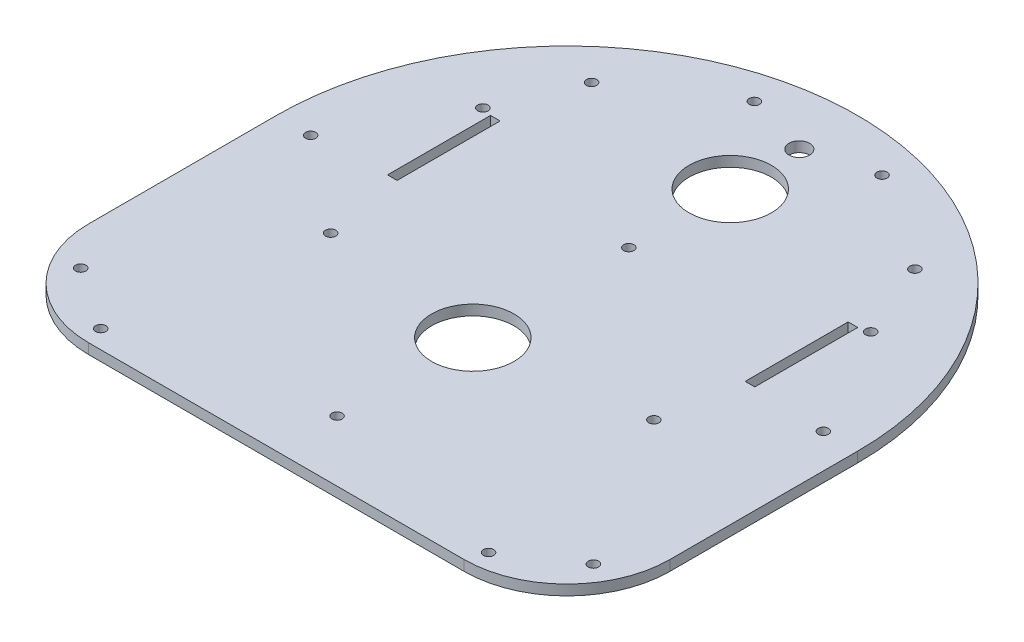
ISO-10303-21;
HEADER;
FILE_DESCRIPTION(('STEP AP214'),'2;1');
FILE_NAME('part.step','',(''),(''),'','','');
FILE_SCHEMA(('AUTOMOTIVE_DESIGN { 1 0 10303 214 1 1 1 1 }'));
ENDSEC;
DATA;
#1=APPLICATION_CONTEXT('core data for automotive mechanical design processes');
#2=APPLICATION_PROTOCOL_DEFINITION('international standard','automotive_design',2000,#1);
#3=PRODUCT_CONTEXT('',#1,'mechanical');
#4=PRODUCT('Part','Part','',(#3));
#5=PRODUCT_RELATED_PRODUCT_CATEGORY('part','',(#4));
#6=PRODUCT_DEFINITION_FORMATION('','',#4);
#7=PRODUCT_DEFINITION_CONTEXT('part definition',#1,'design');
#8=PRODUCT_DEFINITION('design','',#6,#7);
#9=PRODUCT_DEFINITION_SHAPE('','',#8);
#10=(LENGTH_UNIT() NAMED_UNIT(*) SI_UNIT(.MILLI.,.METRE.));
#11=(NAMED_UNIT(*) PLANE_ANGLE_UNIT() SI_UNIT($,.RADIAN.));
#12=(NAMED_UNIT(*) SI_UNIT($,.STERADIAN.) SOLID_ANGLE_UNIT());
#13=UNCERTAINTY_MEASURE_WITH_UNIT(LENGTH_MEASURE(1.E-05),#10,'distance_accuracy_value','');
#14=(GEOMETRIC_REPRESENTATION_CONTEXT(3) GLOBAL_UNCERTAINTY_ASSIGNED_CONTEXT((#13)) GLOBAL_UNIT_ASSIGNED_CONTEXT((#10,
#11,#12)) REPRESENTATION_CONTEXT('',''));
#15=CARTESIAN_POINT('',(0.,0.,0.));
#16=DIRECTION('',(0.,0.,1.));
#17=DIRECTION('',(1.,0.,0.));
#18=AXIS2_PLACEMENT_3D('',#15,#16,#17);
#19=CARTESIAN_POINT('',(-15.8131217350905,3.,0.));
#20=DIRECTION('',(-1.,0.,0.));
#21=DIRECTION('',(0.,0.,1.));
#22=AXIS2_PLACEMENT_3D('',#19,#20,#21);
#23=PLANE('',#22);
#24=DIRECTION('',(0.,0.,-1.));
#25=VECTOR('',#24,1.);
#26=CARTESIAN_POINT('',(-15.8131217350905,0.,0.));
#27=LINE('',#26,#25);
#28=CARTESIAN_POINT('',(-15.8131217350905,0.,40.9116496052906));
#29=VERTEX_POINT('',#28);
#30=CARTESIAN_POINT('',(-15.8131217350905,0.,10.9116496052906));
#31=VERTEX_POINT('',#30);
#32=EDGE_CURVE('E253',#29,#31,#27,.T.);
#33=ORIENTED_EDGE('',*,*,#32,.T.);
#34=DIRECTION('',(0.,-1.,0.));
#35=VECTOR('',#34,1.);
#36=CARTESIAN_POINT('',(-15.8131217350905,3.,10.9116496052906));
#37=LINE('',#36,#35);
#38=CARTESIAN_POINT('',(-15.8131217350905,3.,10.9116496052906));
#39=VERTEX_POINT('',#38);
#40=EDGE_CURVE('E11',#39,#31,#37,.T.);
#41=ORIENTED_EDGE('',*,*,#40,.F.);
#42=DIRECTION('',(0.,0.,-1.));
#43=VECTOR('',#42,1.);
#44=CARTESIAN_POINT('',(-15.8131217350905,3.,0.));
#45=LINE('',#44,#43);
#46=CARTESIAN_POINT('',(-15.8131217350905,3.,40.9116496052906));
#47=VERTEX_POINT('',#46);
#48=EDGE_CURVE('E157',#47,#39,#45,.T.);
#49=ORIENTED_EDGE('',*,*,#48,.F.);
#50=DIRECTION('',(0.,-1.,0.));
#51=VECTOR('',#50,1.);
#52=CARTESIAN_POINT('',(-15.8131217350905,3.,40.9116496052906));
#53=LINE('',#52,#51);
#54=EDGE_CURVE('E272',#47,#29,#53,.T.);
#55=ORIENTED_EDGE('',*,*,#54,.T.);
#56=EDGE_LOOP('',(#33,#41,#49,#55));
#57=FACE_BOUND('',#56,.T.);
#58=ADVANCED_FACE('F38',(#57),#23,.F.);
#59=CARTESIAN_POINT('',(0.,3.,10.9116496052906));
#60=DIRECTION('',(0.,0.,-1.));
#61=DIRECTION('',(-1.,0.,0.));
#62=AXIS2_PLACEMENT_3D('',#59,#60,#61);
#63=PLANE('',#62);
#64=DIRECTION('',(1.,0.,0.));
#65=VECTOR('',#64,1.);
#66=CARTESIAN_POINT('',(0.,0.,10.9116496052906));
#67=LINE('',#66,#65);
#68=CARTESIAN_POINT('',(-13.0131217350905,0.,10.9116496052906));
#69=VERTEX_POINT('',#68);
#70=EDGE_CURVE('E162',#31,#69,#67,.T.);
#71=ORIENTED_EDGE('',*,*,#70,.T.);
#72=DIRECTION('',(0.,-1.,0.));
#73=VECTOR('',#72,1.);
#74=CARTESIAN_POINT('',(-13.0131217350905,3.,10.9116496052906));
#75=LINE('',#74,#73);
#76=CARTESIAN_POINT('',(-13.0131217350905,3.,10.9116496052906));
#77=VERTEX_POINT('',#76);
#78=EDGE_CURVE('E48',#77,#69,#75,.T.);
#79=ORIENTED_EDGE('',*,*,#78,.F.);
#80=DIRECTION('',(1.,0.,0.));
#81=VECTOR('',#80,1.);
#82=CARTESIAN_POINT('',(0.,3.,10.9116496052906));
#83=LINE('',#82,#81);
#84=EDGE_CURVE('E150',#39,#77,#83,.T.);
#85=ORIENTED_EDGE('',*,*,#84,.F.);
#86=ORIENTED_EDGE('',*,*,#40,.T.);
#87=EDGE_LOOP('',(#71,#79,#85,#86));
#88=FACE_BOUND('',#87,.T.);
#89=ADVANCED_FACE('F161',(#88),#63,.F.);
#90=CARTESIAN_POINT('',(-13.0131217350905,3.,0.));
#91=DIRECTION('',(1.,0.,0.));
#92=DIRECTION('',(0.,0.,-1.));
#93=AXIS2_PLACEMENT_3D('',#90,#91,#92);
#94=PLANE('',#93);
#95=DIRECTION('',(0.,0.,1.));
#96=VECTOR('',#95,1.);
#97=CARTESIAN_POINT('',(-13.0131217350905,0.,0.));
#98=LINE('',#97,#96);
#99=CARTESIAN_POINT('',(-13.0131217350905,0.,40.9116496052906));
#100=VERTEX_POINT('',#99);
#101=EDGE_CURVE('E104',#69,#100,#98,.T.);
#102=ORIENTED_EDGE('',*,*,#101,.T.);
#103=DIRECTION('',(0.,-1.,0.));
#104=VECTOR('',#103,1.);
#105=CARTESIAN_POINT('',(-13.0131217350905,3.,40.9116496052906));
#106=LINE('',#105,#104);
#107=CARTESIAN_POINT('',(-13.0131217350905,3.,40.9116496052906));
#108=VERTEX_POINT('',#107);
#109=EDGE_CURVE('E163',#108,#100,#106,.T.);
#110=ORIENTED_EDGE('',*,*,#109,.F.);
#111=DIRECTION('',(0.,0.,1.));
#112=VECTOR('',#111,1.);
#113=CARTESIAN_POINT('',(-13.0131217350905,3.,0.));
#114=LINE('',#113,#112);
#115=EDGE_CURVE('E155',#77,#108,#114,.T.);
#116=ORIENTED_EDGE('',*,*,#115,.F.);
#117=ORIENTED_EDGE('',*,*,#78,.T.);
#118=EDGE_LOOP('',(#102,#110,#116,#117));
#119=FACE_BOUND('',#118,.T.);
#120=ADVANCED_FACE('F165',(#119),#94,.F.);
#121=CARTESIAN_POINT('',(-117.21312173509,3.,0.));
#122=DIRECTION('',(-1.,0.,0.));
#123=DIRECTION('',(0.,0.,1.));
#124=AXIS2_PLACEMENT_3D('',#121,#122,#123);
#125=PLANE('',#124);
#126=DIRECTION('',(0.,0.,-1.));
#127=VECTOR('',#126,1.);
#128=CARTESIAN_POINT('',(-117.21312173509,0.,0.));
#129=LINE('',#128,#127);
#130=CARTESIAN_POINT('',(-117.21312173509,0.,40.9116496052906));
#131=VERTEX_POINT('',#130);
#132=CARTESIAN_POINT('',(-117.21312173509,0.,10.9116496052906));
#133=VERTEX_POINT('',#132);
#134=EDGE_CURVE('E241',#131,#133,#129,.T.);
#135=ORIENTED_EDGE('',*,*,#134,.F.);
#136=DIRECTION('',(0.,-1.,0.));
#137=VECTOR('',#136,1.);
#138=CARTESIAN_POINT('',(-117.21312173509,3.,40.9116496052906));
#139=LINE('',#138,#137);
#140=CARTESIAN_POINT('',(-117.21312173509,3.,40.9116496052906));
#141=VERTEX_POINT('',#140);
#142=EDGE_CURVE('E274',#141,#131,#139,.T.);
#143=ORIENTED_EDGE('',*,*,#142,.F.);
#144=DIRECTION('',(0.,0.,-1.));
#145=VECTOR('',#144,1.);
#146=CARTESIAN_POINT('',(-117.21312173509,3.,0.));
#147=LINE('',#146,#145);
#148=CARTESIAN_POINT('',(-117.21312173509,3.,10.9116496052906));
#149=VERTEX_POINT('',#148);
#150=EDGE_CURVE('E373',#141,#149,#147,.T.);
#151=ORIENTED_EDGE('',*,*,#150,.T.);
#152=DIRECTION('',(0.,-1.,0.));
#153=VECTOR('',#152,1.);
#154=CARTESIAN_POINT('',(-117.21312173509,3.,10.9116496052906));
#155=LINE('',#154,#153);
#156=EDGE_CURVE('E276',#149,#133,#155,.T.);
#157=ORIENTED_EDGE('',*,*,#156,.T.);
#158=EDGE_LOOP('',(#135,#143,#151,#157));
#159=FACE_BOUND('',#158,.T.);
#160=ADVANCED_FACE('F400',(#159),#125,.T.);
#161=CARTESIAN_POINT('',(0.,3.,40.9116496052906));
#162=DIRECTION('',(0.,0.,-1.));
#163=DIRECTION('',(-1.,0.,0.));
#164=AXIS2_PLACEMENT_3D('',#161,#162,#163);
#165=PLANE('',#164);
#166=DIRECTION('',(1.,0.,0.));
#167=VECTOR('',#166,1.);
#168=CARTESIAN_POINT('',(0.,0.,40.9116496052906));
#169=LINE('',#168,#167);
#170=CARTESIAN_POINT('',(-120.01312173509,0.,40.9116496052906));
#171=VERTEX_POINT('',#170);
#172=EDGE_CURVE('E244',#171,#131,#169,.T.);
#173=ORIENTED_EDGE('',*,*,#172,.F.);
#174=DIRECTION('',(0.,-1.,0.));
#175=VECTOR('',#174,1.);
#176=CARTESIAN_POINT('',(-120.01312173509,3.,40.9116496052906));
#177=LINE('',#176,#175);
#178=CARTESIAN_POINT('',(-120.01312173509,3.,40.9116496052906));
#179=VERTEX_POINT('',#178);
#180=EDGE_CURVE('E280',#179,#171,#177,.T.);
#181=ORIENTED_EDGE('',*,*,#180,.F.);
#182=DIRECTION('',(1.,0.,0.));
#183=VECTOR('',#182,1.);
#184=CARTESIAN_POINT('',(0.,3.,40.9116496052906));
#185=LINE('',#184,#183);
#186=EDGE_CURVE('E376',#179,#141,#185,.T.);
#187=ORIENTED_EDGE('',*,*,#186,.T.);
#188=ORIENTED_EDGE('',*,*,#142,.T.);
#189=EDGE_LOOP('',(#173,#181,#187,#188));
#190=FACE_BOUND('',#189,.T.);
#191=ADVANCED_FACE('F402',(#190),#165,.T.);
#192=CARTESIAN_POINT('',(-120.01312173509,3.,0.));
#193=DIRECTION('',(1.,0.,0.));
#194=DIRECTION('',(0.,0.,-1.));
#195=AXIS2_PLACEMENT_3D('',#192,#193,#194);
#196=PLANE('',#195);
#197=DIRECTION('',(0.,0.,1.));
#198=VECTOR('',#197,1.);
#199=CARTESIAN_POINT('',(-120.01312173509,0.,0.));
#200=LINE('',#199,#198);
#201=CARTESIAN_POINT('',(-120.01312173509,0.,10.9116496052906));
#202=VERTEX_POINT('',#201);
#203=EDGE_CURVE('E247',#202,#171,#200,.T.);
#204=ORIENTED_EDGE('',*,*,#203,.F.);
#205=DIRECTION('',(0.,-1.,0.));
#206=VECTOR('',#205,1.);
#207=CARTESIAN_POINT('',(-120.01312173509,3.,10.9116496052906));
#208=LINE('',#207,#206);
#209=CARTESIAN_POINT('',(-120.01312173509,3.,10.9116496052906));
#210=VERTEX_POINT('',#209);
#211=EDGE_CURVE('E278',#210,#202,#208,.T.);
#212=ORIENTED_EDGE('',*,*,#211,.F.);
#213=DIRECTION('',(0.,0.,1.));
#214=VECTOR('',#213,1.);
#215=CARTESIAN_POINT('',(-120.01312173509,3.,0.));
#216=LINE('',#215,#214);
#217=EDGE_CURVE('E379',#210,#179,#216,.T.);
#218=ORIENTED_EDGE('',*,*,#217,.T.);
#219=ORIENTED_EDGE('',*,*,#180,.T.);
#220=EDGE_LOOP('',(#204,#212,#218,#219));
#221=FACE_BOUND('',#220,.T.);
#222=ADVANCED_FACE('F394',(#221),#196,.T.);
#223=CARTESIAN_POINT('',(0.,3.,126.808304592491));
#224=DIRECTION('',(0.,0.,-1.));
#225=DIRECTION('',(-1.,0.,0.));
#226=AXIS2_PLACEMENT_3D('',#223,#224,#225);
#227=PLANE('',#226);
#228=DIRECTION('',(1.,0.,0.));
#229=VECTOR('',#228,1.);
#230=CARTESIAN_POINT('',(0.,0.,126.808304592491));
#231=LINE('',#230,#229);
#232=CARTESIAN_POINT('',(-121.19644922869,0.,126.808304592491));
#233=VERTEX_POINT('',#232);
#234=CARTESIAN_POINT('',(-11.8297942414905,0.,126.808304592491));
#235=VERTEX_POINT('',#234);
#236=EDGE_CURVE('E183',#233,#235,#231,.T.);
#237=ORIENTED_EDGE('',*,*,#236,.T.);
#238=DIRECTION('',(0.,-1.,0.));
#239=VECTOR('',#238,1.);
#240=CARTESIAN_POINT('',(-11.8297942414905,3.,126.808304592491));
#241=LINE('',#240,#239);
#242=CARTESIAN_POINT('',(-11.8297942414905,3.,126.808304592491));
#243=VERTEX_POINT('',#242);
#244=EDGE_CURVE('E42',#243,#235,#241,.T.);
#245=ORIENTED_EDGE('',*,*,#244,.F.);
#246=DIRECTION('',(1.,0.,0.));
#247=VECTOR('',#246,1.);
#248=CARTESIAN_POINT('',(0.,3.,126.808304592491));
#249=LINE('',#248,#247);
#250=CARTESIAN_POINT('',(-121.19644922869,3.,126.808304592491));
#251=VERTEX_POINT('',#250);
#252=EDGE_CURVE('E271',#251,#243,#249,.T.);
#253=ORIENTED_EDGE('',*,*,#252,.F.);
#254=DIRECTION('',(0.,-1.,0.));
#255=VECTOR('',#254,1.);
#256=CARTESIAN_POINT('',(-121.19644922869,3.,126.808304592491));
#257=LINE('',#256,#255);
#258=EDGE_CURVE('E182',#251,#233,#257,.T.);
#259=ORIENTED_EDGE('',*,*,#258,.T.);
#260=EDGE_LOOP('',(#237,#245,#253,#259));
#261=FACE_BOUND('',#260,.T.);
#262=ADVANCED_FACE('F40',(#261),#227,.F.);
#263=CARTESIAN_POINT('',(-11.8297942414905,3.,96.8083045924906));
#264=DIRECTION('',(0.,-1.,0.));
#265=DIRECTION('',(0.,0.,-1.));
#266=AXIS2_PLACEMENT_3D('',#263,#264,#265);
#267=CYLINDRICAL_SURFACE('',#266,30.);
#268=CARTESIAN_POINT('',(-11.8297942414905,0.,96.8083045924906));
#269=DIRECTION('',(0.,1.,0.));
#270=DIRECTION('',(0.,0.,1.));
#271=AXIS2_PLACEMENT_3D('',#268,#269,#270);
#272=CIRCLE('',#271,30.);
#273=CARTESIAN_POINT('',(18.1702057585095,0.,96.8083045924906));
#274=VERTEX_POINT('',#273);
#275=EDGE_CURVE('E186',#235,#274,#272,.T.);
#276=ORIENTED_EDGE('',*,*,#275,.T.);
#277=DIRECTION('',(0.,-1.,0.));
#278=VECTOR('',#277,1.);
#279=CARTESIAN_POINT('',(18.1702057585095,3.,96.8083045924906));
#280=LINE('',#279,#278);
#281=CARTESIAN_POINT('',(18.1702057585095,3.,96.8083045924906));
#282=VERTEX_POINT('',#281);
#283=EDGE_CURVE('E293',#282,#274,#280,.T.);
#284=ORIENTED_EDGE('',*,*,#283,.F.);
#285=CARTESIAN_POINT('',(-11.8297942414905,3.,96.8083045924906));
#286=DIRECTION('',(0.,1.,0.));
#287=DIRECTION('',(0.,0.,1.));
#288=AXIS2_PLACEMENT_3D('',#285,#286,#287);
#289=CIRCLE('',#288,30.);
#290=EDGE_CURVE('E119',#243,#282,#289,.T.);
#291=ORIENTED_EDGE('',*,*,#290,.F.);
#292=ORIENTED_EDGE('',*,*,#244,.T.);
#293=EDGE_LOOP('',(#276,#284,#291,#292));
#294=FACE_BOUND('',#293,.T.);
#295=ADVANCED_FACE('F299',(#294),#267,.T.);
#296=CARTESIAN_POINT('',(18.1702057585095,3.,0.));
#297=DIRECTION('',(-1.,0.,0.));
#298=DIRECTION('',(0.,0.,1.));
#299=AXIS2_PLACEMENT_3D('',#296,#297,#298);
#300=PLANE('',#299);
#301=DIRECTION('',(0.,0.,-1.));
#302=VECTOR('',#301,1.);
#303=CARTESIAN_POINT('',(18.1702057585095,0.,0.));
#304=LINE('',#303,#302);
#305=CARTESIAN_POINT('',(18.1702057585095,0.,42.1249770988906));
#306=VERTEX_POINT('',#305);
#307=EDGE_CURVE('E188',#274,#306,#304,.T.);
#308=ORIENTED_EDGE('',*,*,#307,.T.);
#309=DIRECTION('',(0.,-1.,0.));
#310=VECTOR('',#309,1.);
#311=CARTESIAN_POINT('',(18.1702057585095,3.,42.1249770988906));
#312=LINE('',#311,#310);
#313=CARTESIAN_POINT('',(18.1702057585095,3.,42.1249770988906));
#314=VERTEX_POINT('',#313);
#315=EDGE_CURVE('E291',#314,#306,#312,.T.);
#316=ORIENTED_EDGE('',*,*,#315,.F.);
#317=DIRECTION('',(0.,0.,-1.));
#318=VECTOR('',#317,1.);
#319=CARTESIAN_POINT('',(18.1702057585095,3.,0.));
#320=LINE('',#319,#318);
#321=EDGE_CURVE('E320',#282,#314,#320,.T.);
#322=ORIENTED_EDGE('',*,*,#321,.F.);
#323=ORIENTED_EDGE('',*,*,#283,.T.);
#324=EDGE_LOOP('',(#308,#316,#322,#323));
#325=FACE_BOUND('',#324,.T.);
#326=ADVANCED_FACE('F311',(#325),#300,.F.);
#327=CARTESIAN_POINT('',(-66.5131217350905,3.,42.1249770988906));
#328=DIRECTION('',(0.,-1.,0.));
#329=DIRECTION('',(0.,0.,-1.));
#330=AXIS2_PLACEMENT_3D('',#327,#328,#329);
#331=CYLINDRICAL_SURFACE('',#330,84.6833274936);
#332=CARTESIAN_POINT('',(-66.5131217350905,0.,42.1249770988906));
#333=DIRECTION('',(0.,1.,0.));
#334=DIRECTION('',(0.,0.,1.));
#335=AXIS2_PLACEMENT_3D('',#332,#333,#334);
#336=CIRCLE('',#335,84.6833274936);
#337=CARTESIAN_POINT('',(-151.196449228691,0.,42.1249770988906));
#338=VERTEX_POINT('',#337);
#339=EDGE_CURVE('E190',#306,#338,#336,.T.);
#340=ORIENTED_EDGE('',*,*,#339,.T.);
#341=DIRECTION('',(0.,-1.,0.));
#342=VECTOR('',#341,1.);
#343=CARTESIAN_POINT('',(-151.196449228691,3.,42.1249770988906));
#344=LINE('',#343,#342);
#345=CARTESIAN_POINT('',(-151.196449228691,3.,42.1249770988906));
#346=VERTEX_POINT('',#345);
#347=EDGE_CURVE('E288',#346,#338,#344,.T.);
#348=ORIENTED_EDGE('',*,*,#347,.F.);
#349=CARTESIAN_POINT('',(-66.5131217350905,3.,42.1249770988906));
#350=DIRECTION('',(0.,1.,0.));
#351=DIRECTION('',(0.,0.,1.));
#352=AXIS2_PLACEMENT_3D('',#349,#350,#351);
#353=CIRCLE('',#352,84.6833274936);
#354=EDGE_CURVE('E316',#314,#346,#353,.T.);
#355=ORIENTED_EDGE('',*,*,#354,.F.);
#356=ORIENTED_EDGE('',*,*,#315,.T.);
#357=EDGE_LOOP('',(#340,#348,#355,#356));
#358=FACE_BOUND('',#357,.T.);
#359=ADVANCED_FACE('F314',(#358),#331,.T.);
#360=CARTESIAN_POINT('',(-151.196449228691,3.,0.));
#361=DIRECTION('',(1.,0.,0.));
#362=DIRECTION('',(0.,0.,-1.));
#363=AXIS2_PLACEMENT_3D('',#360,#361,#362);
#364=PLANE('',#363);
#365=DIRECTION('',(0.,0.,1.));
#366=VECTOR('',#365,1.);
#367=CARTESIAN_POINT('',(-151.196449228691,0.,0.));
#368=LINE('',#367,#366);
#369=CARTESIAN_POINT('',(-151.196449228691,0.,96.8083045924906));
#370=VERTEX_POINT('',#369);
#371=EDGE_CURVE('E192',#338,#370,#368,.T.);
#372=ORIENTED_EDGE('',*,*,#371,.T.);
#373=DIRECTION('',(0.,-1.,0.));
#374=VECTOR('',#373,1.);
#375=CARTESIAN_POINT('',(-151.196449228691,3.,96.8083045924906));
#376=LINE('',#375,#374);
#377=CARTESIAN_POINT('',(-151.196449228691,3.,96.8083045924906));
#378=VERTEX_POINT('',#377);
#379=EDGE_CURVE('E285',#378,#370,#376,.T.);
#380=ORIENTED_EDGE('',*,*,#379,.F.);
#381=DIRECTION('',(0.,0.,1.));
#382=VECTOR('',#381,1.);
#383=CARTESIAN_POINT('',(-151.196449228691,3.,0.));
#384=LINE('',#383,#382);
#385=EDGE_CURVE('E319',#346,#378,#384,.T.);
#386=ORIENTED_EDGE('',*,*,#385,.F.);
#387=ORIENTED_EDGE('',*,*,#347,.T.);
#388=EDGE_LOOP('',(#372,#380,#386,#387));
#389=FACE_BOUND('',#388,.T.);
#390=ADVANCED_FACE('F489',(#389),#364,.F.);
#391=CARTESIAN_POINT('',(-85.1091771215905,3.,-31.0583503909369));
#392=DIRECTION('',(0.,-1.,0.));
#393=DIRECTION('',(0.,0.,-1.));
#394=AXIS2_PLACEMENT_3D('',#391,#392,#393);
#395=CYLINDRICAL_SURFACE('',#394,1.5);
#396=CARTESIAN_POINT('',(-85.1091771215905,3.,-31.0583503909369));
#397=DIRECTION('',(0.,1.,0.));
#398=DIRECTION('',(0.,0.,1.));
#399=AXIS2_PLACEMENT_3D('',#396,#397,#398);
#400=CIRCLE('',#399,1.5);
#401=CARTESIAN_POINT('',(-85.1091771215905,3.,-29.5583503909369));
#402=VERTEX_POINT('',#401);
#403=EDGE_CURVE('E176',#402,#402,#400,.T.);
#404=ORIENTED_EDGE('',*,*,#403,.T.);
#405=EDGE_LOOP('',(#404));
#406=FACE_BOUND('',#405,.T.);
#407=CARTESIAN_POINT('',(-85.1091771215905,0.,-31.0583503909369));
#408=DIRECTION('',(0.,1.,0.));
#409=DIRECTION('',(0.,0.,1.));
#410=AXIS2_PLACEMENT_3D('',#407,#408,#409);
#411=CIRCLE('',#410,1.5);
#412=CARTESIAN_POINT('',(-85.1091771215905,0.,-29.5583503909369));
#413=VERTEX_POINT('',#412);
#414=EDGE_CURVE('E265',#413,#413,#411,.T.);
#415=ORIENTED_EDGE('',*,*,#414,.F.);
#416=EDGE_LOOP('',(#415));
#417=FACE_BOUND('',#416,.T.);
#418=ADVANCED_FACE('F498',(#406,#417),#395,.F.);
#419=CARTESIAN_POINT('',(-113.60917712159,3.,63.9122667251906));
#420=DIRECTION('',(0.,-1.,0.));
#421=DIRECTION('',(0.,0.,-1.));
#422=AXIS2_PLACEMENT_3D('',#419,#420,#421);
#423=CYLINDRICAL_SURFACE('',#422,1.5);
#424=CARTESIAN_POINT('',(-113.60917712159,3.,63.9122667251906));
#425=DIRECTION('',(0.,1.,0.));
#426=DIRECTION('',(0.,0.,1.));
#427=AXIS2_PLACEMENT_3D('',#424,#425,#426);
#428=CIRCLE('',#427,1.5);
#429=CARTESIAN_POINT('',(-113.60917712159,3.,65.4122667251906));
#430=VERTEX_POINT('',#429);
#431=EDGE_CURVE('E173',#430,#430,#428,.T.);
#432=ORIENTED_EDGE('',*,*,#431,.T.);
#433=EDGE_LOOP('',(#432));
#434=FACE_BOUND('',#433,.T.);
#435=CARTESIAN_POINT('',(-113.60917712159,0.,63.9122667251906));
#436=DIRECTION('',(0.,1.,0.));
#437=DIRECTION('',(0.,0.,1.));
#438=AXIS2_PLACEMENT_3D('',#435,#436,#437);
#439=CIRCLE('',#438,1.5);
#440=CARTESIAN_POINT('',(-113.60917712159,0.,65.4122667251906));
#441=VERTEX_POINT('',#440);
#442=EDGE_CURVE('E262',#441,#441,#439,.T.);
#443=ORIENTED_EDGE('',*,*,#442,.F.);
#444=EDGE_LOOP('',(#443));
#445=FACE_BOUND('',#444,.T.);
#446=ADVANCED_FACE('F435',(#434,#445),#423,.F.);
#447=CARTESIAN_POINT('',(-19.4170663486905,3.,63.9122667251906));
#448=DIRECTION('',(0.,-1.,0.));
#449=DIRECTION('',(0.,0.,-1.));
#450=AXIS2_PLACEMENT_3D('',#447,#448,#449);
#451=CYLINDRICAL_SURFACE('',#450,1.5);
#452=CARTESIAN_POINT('',(-19.4170663486905,3.,63.9122667251906));
#453=DIRECTION('',(0.,1.,0.));
#454=DIRECTION('',(0.,0.,1.));
#455=AXIS2_PLACEMENT_3D('',#452,#453,#454);
#456=CIRCLE('',#455,1.5);
#457=CARTESIAN_POINT('',(-19.4170663486905,3.,65.4122667251906));
#458=VERTEX_POINT('',#457);
#459=EDGE_CURVE('E167',#458,#458,#456,.T.);
#460=ORIENTED_EDGE('',*,*,#459,.T.);
#461=EDGE_LOOP('',(#460));
#462=FACE_BOUND('',#461,.T.);
#463=CARTESIAN_POINT('',(-19.4170663486905,0.,63.9122667251906));
#464=DIRECTION('',(0.,1.,0.));
#465=DIRECTION('',(0.,0.,1.));
#466=AXIS2_PLACEMENT_3D('',#463,#464,#465);
#467=CIRCLE('',#466,1.5);
#468=CARTESIAN_POINT('',(-19.4170663486905,0.,65.4122667251906));
#469=VERTEX_POINT('',#468);
#470=EDGE_CURVE('E259',#469,#469,#467,.T.);
#471=ORIENTED_EDGE('',*,*,#470,.F.);
#472=EDGE_LOOP('',(#471));
#473=FACE_BOUND('',#472,.T.);
#474=ADVANCED_FACE('F430',(#462,#473),#451,.F.);
#475=CARTESIAN_POINT('',(0.,3.,40.9116496052906));
#476=DIRECTION('',(0.,0.,1.));
#477=DIRECTION('',(1.,0.,0.));
#478=AXIS2_PLACEMENT_3D('',#475,#476,#477);
#479=PLANE('',#478);
#480=DIRECTION('',(-1.,0.,0.));
#481=VECTOR('',#480,1.);
#482=CARTESIAN_POINT('',(0.,0.,40.9116496052906));
#483=LINE('',#482,#481);
#484=EDGE_CURVE('E110',#100,#29,#483,.T.);
#485=ORIENTED_EDGE('',*,*,#484,.T.);
#486=ORIENTED_EDGE('',*,*,#54,.F.);
#487=DIRECTION('',(-1.,0.,0.));
#488=VECTOR('',#487,1.);
#489=CARTESIAN_POINT('',(0.,3.,40.9116496052906));
#490=LINE('',#489,#488);
#491=EDGE_CURVE('E57',#108,#47,#490,.T.);
#492=ORIENTED_EDGE('',*,*,#491,.F.);
#493=ORIENTED_EDGE('',*,*,#109,.T.);
#494=EDGE_LOOP('',(#485,#486,#492,#493));
#495=FACE_BOUND('',#494,.T.);
#496=ADVANCED_FACE('F422',(#495),#479,.F.);
#497=CARTESIAN_POINT('',(0.,3.,10.9116496052906));
#498=DIRECTION('',(0.,0.,1.));
#499=DIRECTION('',(1.,0.,0.));
#500=AXIS2_PLACEMENT_3D('',#497,#498,#499);
#501=PLANE('',#500);
#502=DIRECTION('',(-1.,0.,0.));
#503=VECTOR('',#502,1.);
#504=CARTESIAN_POINT('',(0.,0.,10.9116496052906));
#505=LINE('',#504,#503);
#506=EDGE_CURVE('E250',#133,#202,#505,.T.);
#507=ORIENTED_EDGE('',*,*,#506,.F.);
#508=ORIENTED_EDGE('',*,*,#156,.F.);
#509=DIRECTION('',(-1.,0.,0.));
#510=VECTOR('',#509,1.);
#511=CARTESIAN_POINT('',(0.,3.,10.9116496052906));
#512=LINE('',#511,#510);
#513=EDGE_CURVE('E382',#149,#210,#512,.T.);
#514=ORIENTED_EDGE('',*,*,#513,.T.);
#515=ORIENTED_EDGE('',*,*,#211,.T.);
#516=EDGE_LOOP('',(#507,#508,#514,#515));
#517=FACE_BOUND('',#516,.T.);
#518=ADVANCED_FACE('F387',(#517),#501,.T.);
#519=CARTESIAN_POINT('',(-19.4170663485905,3.,-12.1339985257094));
#520=DIRECTION('',(0.,-1.,0.));
#521=DIRECTION('',(0.,0.,-1.));
#522=AXIS2_PLACEMENT_3D('',#519,#520,#521);
#523=CYLINDRICAL_SURFACE('',#522,1.50000000000001);
#524=CARTESIAN_POINT('',(-19.4170663485905,3.,-12.1339985257094));
#525=DIRECTION('',(0.,1.,0.));
#526=DIRECTION('',(0.,0.,1.));
#527=AXIS2_PLACEMENT_3D('',#524,#525,#526);
#528=CIRCLE('',#527,1.50000000000001);
#529=CARTESIAN_POINT('',(-19.4170663485905,3.,-10.6339985257094));
#530=VERTEX_POINT('',#529);
#531=EDGE_CURVE('E370',#530,#530,#528,.T.);
#532=ORIENTED_EDGE('',*,*,#531,.T.);
#533=EDGE_LOOP('',(#532));
#534=FACE_BOUND('',#533,.T.);
#535=CARTESIAN_POINT('',(-19.4170663485905,0.,-12.1339985257094));
#536=DIRECTION('',(0.,1.,0.));
#537=DIRECTION('',(0.,0.,1.));
#538=AXIS2_PLACEMENT_3D('',#535,#536,#537);
#539=CIRCLE('',#538,1.50000000000001);
#540=CARTESIAN_POINT('',(-19.4170663485905,0.,-10.6339985257094));
#541=VERTEX_POINT('',#540);
#542=EDGE_CURVE('E238',#541,#541,#539,.T.);
#543=ORIENTED_EDGE('',*,*,#542,.F.);
#544=EDGE_LOOP('',(#543));
#545=FACE_BOUND('',#544,.T.);
#546=ADVANCED_FACE('F421',(#534,#545),#523,.F.);
#547=CARTESIAN_POINT('',(-113.60917712159,3.,-12.1339985257094));
#548=DIRECTION('',(0.,-1.,0.));
#549=DIRECTION('',(0.,0.,-1.));
#550=AXIS2_PLACEMENT_3D('',#547,#548,#549);
#551=CYLINDRICAL_SURFACE('',#550,1.5);
#552=CARTESIAN_POINT('',(-113.60917712159,3.,-12.1339985257094));
#553=DIRECTION('',(0.,1.,0.));
#554=DIRECTION('',(0.,0.,1.));
#555=AXIS2_PLACEMENT_3D('',#552,#553,#554);
#556=CIRCLE('',#555,1.5);
#557=CARTESIAN_POINT('',(-113.60917712159,3.,-10.6339985257094));
#558=VERTEX_POINT('',#557);
#559=EDGE_CURVE('E367',#558,#558,#556,.T.);
#560=ORIENTED_EDGE('',*,*,#559,.T.);
#561=EDGE_LOOP('',(#560));
#562=FACE_BOUND('',#561,.T.);
#563=CARTESIAN_POINT('',(-113.60917712159,0.,-12.1339985257094));
#564=DIRECTION('',(0.,1.,0.));
#565=DIRECTION('',(0.,0.,1.));
#566=AXIS2_PLACEMENT_3D('',#563,#564,#565);
#567=CIRCLE('',#566,1.5);
#568=CARTESIAN_POINT('',(-113.60917712159,0.,-10.6339985257094));
#569=VERTEX_POINT('',#568);
#570=EDGE_CURVE('E235',#569,#569,#567,.T.);
#571=ORIENTED_EDGE('',*,*,#570,.F.);
#572=EDGE_LOOP('',(#571));
#573=FACE_BOUND('',#572,.T.);
#574=ADVANCED_FACE('F427',(#562,#573),#551,.F.);
#575=CARTESIAN_POINT('',(8.17020575850951,3.,42.1249770988906));
#576=DIRECTION('',(0.,-1.,0.));
#577=DIRECTION('',(0.,0.,-1.));
#578=AXIS2_PLACEMENT_3D('',#575,#576,#577);
#579=CYLINDRICAL_SURFACE('',#578,1.49999999999999);
#580=CARTESIAN_POINT('',(8.17020575850951,3.,42.1249770988906));
#581=DIRECTION('',(0.,1.,0.));
#582=DIRECTION('',(0.,0.,1.));
#583=AXIS2_PLACEMENT_3D('',#580,#581,#582);
#584=CIRCLE('',#583,1.49999999999999);
#585=CARTESIAN_POINT('',(8.17020575850951,3.,43.6249770988906));
#586=VERTEX_POINT('',#585);
#587=EDGE_CURVE('E364',#586,#586,#584,.T.);
#588=ORIENTED_EDGE('',*,*,#587,.T.);
#589=EDGE_LOOP('',(#588));
#590=FACE_BOUND('',#589,.T.);
#591=CARTESIAN_POINT('',(8.17020575850951,0.,42.1249770988906));
#592=DIRECTION('',(0.,1.,0.));
#593=DIRECTION('',(0.,0.,1.));
#594=AXIS2_PLACEMENT_3D('',#591,#592,#593);
#595=CIRCLE('',#594,1.49999999999999);
#596=CARTESIAN_POINT('',(8.17020575850951,0.,43.6249770988906));
#597=VERTEX_POINT('',#596);
#598=EDGE_CURVE('E232',#597,#597,#595,.T.);
#599=ORIENTED_EDGE('',*,*,#598,.F.);
#600=EDGE_LOOP('',(#599));
#601=FACE_BOUND('',#600,.T.);
#602=ADVANCED_FACE('F547',(#590,#601),#579,.F.);
#603=CARTESIAN_POINT('',(-141.196449228691,3.,42.1249770988906));
#604=DIRECTION('',(0.,-1.,0.));
#605=DIRECTION('',(0.,0.,-1.));
#606=AXIS2_PLACEMENT_3D('',#603,#604,#605);
#607=CYLINDRICAL_SURFACE('',#606,1.5);
#608=CARTESIAN_POINT('',(-141.196449228691,3.,42.1249770988906));
#609=DIRECTION('',(0.,1.,0.));
#610=DIRECTION('',(0.,0.,1.));
#611=AXIS2_PLACEMENT_3D('',#608,#609,#610);
#612=CIRCLE('',#611,1.5);
#613=CARTESIAN_POINT('',(-141.196449228691,3.,43.6249770988906));
#614=VERTEX_POINT('',#613);
#615=EDGE_CURVE('E361',#614,#614,#612,.T.);
#616=ORIENTED_EDGE('',*,*,#615,.T.);
#617=EDGE_LOOP('',(#616));
#618=FACE_BOUND('',#617,.T.);
#619=CARTESIAN_POINT('',(-141.196449228691,0.,42.1249770988906));
#620=DIRECTION('',(0.,1.,0.));
#621=DIRECTION('',(0.,0.,1.));
#622=AXIS2_PLACEMENT_3D('',#619,#620,#621);
#623=CIRCLE('',#622,1.5);
#624=CARTESIAN_POINT('',(-141.196449228691,0.,43.6249770988906));
#625=VERTEX_POINT('',#624);
#626=EDGE_CURVE('E229',#625,#625,#623,.T.);
#627=ORIENTED_EDGE('',*,*,#626,.F.);
#628=EDGE_LOOP('',(#627));
#629=FACE_BOUND('',#628,.T.);
#630=ADVANCED_FACE('F557',(#618,#629),#607,.F.);
#631=CARTESIAN_POINT('',(-66.5131217350905,3.,-5.43527823670937));
#632=DIRECTION('',(0.,-1.,0.));
#633=DIRECTION('',(0.,0.,-1.));
#634=AXIS2_PLACEMENT_3D('',#631,#632,#633);
#635=CYLINDRICAL_SURFACE('',#634,12.);
#636=CARTESIAN_POINT('',(-66.5131217350905,3.,-5.43527823670937));
#637=DIRECTION('',(0.,1.,0.));
#638=DIRECTION('',(0.,0.,1.));
#639=AXIS2_PLACEMENT_3D('',#636,#637,#638);
#640=CIRCLE('',#639,12.);
#641=CARTESIAN_POINT('',(-66.5131217350905,3.,6.56472176329062));
#642=VERTEX_POINT('',#641);
#643=EDGE_CURVE('E358',#642,#642,#640,.T.);
#644=ORIENTED_EDGE('',*,*,#643,.T.);
#645=EDGE_LOOP('',(#644));
#646=FACE_BOUND('',#645,.T.);
#647=CARTESIAN_POINT('',(-66.5131217350905,0.,-5.43527823670937));
#648=DIRECTION('',(0.,1.,0.));
#649=DIRECTION('',(0.,0.,1.));
#650=AXIS2_PLACEMENT_3D('',#647,#648,#649);
#651=CIRCLE('',#650,12.);
#652=CARTESIAN_POINT('',(-66.5131217350905,0.,6.56472176329062));
#653=VERTEX_POINT('',#652);
#654=EDGE_CURVE('E226',#653,#653,#651,.T.);
#655=ORIENTED_EDGE('',*,*,#654,.F.);
#656=EDGE_LOOP('',(#655));
#657=FACE_BOUND('',#656,.T.);
#658=ADVANCED_FACE('F567',(#646,#657),#635,.F.);
#659=CARTESIAN_POINT('',(-66.5131217350905,3.,-25.5583503947094));
#660=DIRECTION('',(0.,-1.,0.));
#661=DIRECTION('',(0.,0.,-1.));
#662=AXIS2_PLACEMENT_3D('',#659,#660,#661);
#663=CYLINDRICAL_SURFACE('',#662,2.99999999999999);
#664=CARTESIAN_POINT('',(-66.5131217350905,3.,-25.5583503947094));
#665=DIRECTION('',(0.,1.,0.));
#666=DIRECTION('',(0.,0.,1.));
#667=AXIS2_PLACEMENT_3D('',#664,#665,#666);
#668=CIRCLE('',#667,2.99999999999999);
#669=CARTESIAN_POINT('',(-66.5131217350905,3.,-22.5583503947094));
#670=VERTEX_POINT('',#669);
#671=EDGE_CURVE('E355',#670,#670,#668,.T.);
#672=ORIENTED_EDGE('',*,*,#671,.T.);
#673=EDGE_LOOP('',(#672));
#674=FACE_BOUND('',#673,.T.);
#675=CARTESIAN_POINT('',(-66.5131217350905,0.,-25.5583503947094));
#676=DIRECTION('',(0.,1.,0.));
#677=DIRECTION('',(0.,0.,1.));
#678=AXIS2_PLACEMENT_3D('',#675,#676,#677);
#679=CIRCLE('',#678,2.99999999999999);
#680=CARTESIAN_POINT('',(-66.5131217350905,0.,-22.5583503947094));
#681=VERTEX_POINT('',#680);
#682=EDGE_CURVE('E223',#681,#681,#679,.T.);
#683=ORIENTED_EDGE('',*,*,#682,.F.);
#684=EDGE_LOOP('',(#683));
#685=FACE_BOUND('',#684,.T.);
#686=ADVANCED_FACE('F577',(#674,#685),#663,.F.);
#687=CARTESIAN_POINT('',(-66.5131217350905,3.,69.5647217632906));
#688=DIRECTION('',(0.,-1.,0.));
#689=DIRECTION('',(0.,0.,-1.));
#690=AXIS2_PLACEMENT_3D('',#687,#688,#689);
#691=CYLINDRICAL_SURFACE('',#690,12.);
#692=CARTESIAN_POINT('',(-66.5131217350905,3.,69.5647217632906));
#693=DIRECTION('',(0.,1.,0.));
#694=DIRECTION('',(0.,0.,1.));
#695=AXIS2_PLACEMENT_3D('',#692,#693,#694);
#696=CIRCLE('',#695,12.);
#697=CARTESIAN_POINT('',(-66.5131217350905,3.,81.5647217632906));
#698=VERTEX_POINT('',#697);
#699=EDGE_CURVE('E352',#698,#698,#696,.T.);
#700=ORIENTED_EDGE('',*,*,#699,.T.);
#701=EDGE_LOOP('',(#700));
#702=FACE_BOUND('',#701,.T.);
#703=CARTESIAN_POINT('',(-66.5131217350905,0.,69.5647217632906));
#704=DIRECTION('',(0.,1.,0.));
#705=DIRECTION('',(0.,0.,1.));
#706=AXIS2_PLACEMENT_3D('',#703,#704,#705);
#707=CIRCLE('',#706,12.);
#708=CARTESIAN_POINT('',(-66.5131217350905,0.,81.5647217632906));
#709=VERTEX_POINT('',#708);
#710=EDGE_CURVE('E220',#709,#709,#707,.T.);
#711=ORIENTED_EDGE('',*,*,#710,.F.);
#712=EDGE_LOOP('',(#711));
#713=FACE_BOUND('',#712,.T.);
#714=ADVANCED_FACE('F587',(#702,#713),#691,.F.);
#715=CARTESIAN_POINT('',(-123.01312173509,3.,10.1384062121906));
#716=DIRECTION('',(0.,-1.,0.));
#717=DIRECTION('',(0.,0.,-1.));
#718=AXIS2_PLACEMENT_3D('',#715,#716,#717);
#719=CYLINDRICAL_SURFACE('',#718,1.5);
#720=CARTESIAN_POINT('',(-123.01312173509,3.,10.1384062121906));
#721=DIRECTION('',(0.,1.,0.));
#722=DIRECTION('',(0.,0.,1.));
#723=AXIS2_PLACEMENT_3D('',#720,#721,#722);
#724=CIRCLE('',#723,1.5);
#725=CARTESIAN_POINT('',(-123.01312173509,3.,11.6384062121906));
#726=VERTEX_POINT('',#725);
#727=EDGE_CURVE('E349',#726,#726,#724,.T.);
#728=ORIENTED_EDGE('',*,*,#727,.T.);
#729=EDGE_LOOP('',(#728));
#730=FACE_BOUND('',#729,.T.);
#731=CARTESIAN_POINT('',(-123.01312173509,0.,10.1384062121906));
#732=DIRECTION('',(0.,1.,0.));
#733=DIRECTION('',(0.,0.,1.));
#734=AXIS2_PLACEMENT_3D('',#731,#732,#733);
#735=CIRCLE('',#734,1.5);
#736=CARTESIAN_POINT('',(-123.01312173509,0.,11.6384062121906));
#737=VERTEX_POINT('',#736);
#738=EDGE_CURVE('E217',#737,#737,#735,.T.);
#739=ORIENTED_EDGE('',*,*,#738,.F.);
#740=EDGE_LOOP('',(#739));
#741=FACE_BOUND('',#740,.T.);
#742=ADVANCED_FACE('F597',(#730,#741),#719,.F.);
#743=CARTESIAN_POINT('',(-10.0131217350905,3.,10.1384062121906));
#744=DIRECTION('',(0.,-1.,0.));
#745=DIRECTION('',(0.,0.,-1.));
#746=AXIS2_PLACEMENT_3D('',#743,#744,#745);
#747=CYLINDRICAL_SURFACE('',#746,1.49999999999999);
#748=CARTESIAN_POINT('',(-10.0131217350905,3.,10.1384062121906));
#749=DIRECTION('',(0.,1.,0.));
#750=DIRECTION('',(0.,0.,1.));
#751=AXIS2_PLACEMENT_3D('',#748,#749,#750);
#752=CIRCLE('',#751,1.49999999999999);
#753=CARTESIAN_POINT('',(-10.0131217350905,3.,11.6384062121906));
#754=VERTEX_POINT('',#753);
#755=EDGE_CURVE('E346',#754,#754,#752,.T.);
#756=ORIENTED_EDGE('',*,*,#755,.T.);
#757=EDGE_LOOP('',(#756));
#758=FACE_BOUND('',#757,.T.);
#759=CARTESIAN_POINT('',(-10.0131217350905,0.,10.1384062121906));
#760=DIRECTION('',(0.,1.,0.));
#761=DIRECTION('',(0.,0.,1.));
#762=AXIS2_PLACEMENT_3D('',#759,#760,#761);
#763=CIRCLE('',#762,1.49999999999999);
#764=CARTESIAN_POINT('',(-10.0131217350905,0.,11.6384062121906));
#765=VERTEX_POINT('',#764);
#766=EDGE_CURVE('E214',#765,#765,#763,.T.);
#767=ORIENTED_EDGE('',*,*,#766,.F.);
#768=EDGE_LOOP('',(#767));
#769=FACE_BOUND('',#768,.T.);
#770=ADVANCED_FACE('F607',(#758,#769),#747,.F.);
#771=CARTESIAN_POINT('',(-10.0131217350905,3.,121.478406212191));
#772=DIRECTION('',(0.,-1.,0.));
#773=DIRECTION('',(0.,0.,-1.));
#774=AXIS2_PLACEMENT_3D('',#771,#772,#773);
#775=CYLINDRICAL_SURFACE('',#774,1.50000000000003);
#776=CARTESIAN_POINT('',(-10.0131217350905,3.,121.478406212191));
#777=DIRECTION('',(0.,1.,0.));
#778=DIRECTION('',(0.,0.,1.));
#779=AXIS2_PLACEMENT_3D('',#776,#777,#778);
#780=CIRCLE('',#779,1.50000000000003);
#781=CARTESIAN_POINT('',(-10.0131217350905,3.,122.978406212191));
#782=VERTEX_POINT('',#781);
#783=EDGE_CURVE('E343',#782,#782,#780,.T.);
#784=ORIENTED_EDGE('',*,*,#783,.T.);
#785=EDGE_LOOP('',(#784));
#786=FACE_BOUND('',#785,.T.);
#787=CARTESIAN_POINT('',(-10.0131217350905,0.,121.478406212191));
#788=DIRECTION('',(0.,1.,0.));
#789=DIRECTION('',(0.,0.,1.));
#790=AXIS2_PLACEMENT_3D('',#787,#788,#789);
#791=CIRCLE('',#790,1.50000000000003);
#792=CARTESIAN_POINT('',(-10.0131217350905,0.,122.978406212191));
#793=VERTEX_POINT('',#792);
#794=EDGE_CURVE('E211',#793,#793,#791,.T.);
#795=ORIENTED_EDGE('',*,*,#794,.F.);
#796=EDGE_LOOP('',(#795));
#797=FACE_BOUND('',#796,.T.);
#798=ADVANCED_FACE('F617',(#786,#797),#775,.F.);
#799=CARTESIAN_POINT('',(-123.01312173509,3.,121.478406212191));
#800=DIRECTION('',(0.,-1.,0.));
#801=DIRECTION('',(0.,0.,-1.));
#802=AXIS2_PLACEMENT_3D('',#799,#800,#801);
#803=CYLINDRICAL_SURFACE('',#802,1.5);
#804=CARTESIAN_POINT('',(-123.01312173509,3.,121.478406212191));
#805=DIRECTION('',(0.,1.,0.));
#806=DIRECTION('',(0.,0.,1.));
#807=AXIS2_PLACEMENT_3D('',#804,#805,#806);
#808=CIRCLE('',#807,1.5);
#809=CARTESIAN_POINT('',(-123.01312173509,3.,122.978406212191));
#810=VERTEX_POINT('',#809);
#811=EDGE_CURVE('E340',#810,#810,#808,.T.);
#812=ORIENTED_EDGE('',*,*,#811,.T.);
#813=EDGE_LOOP('',(#812));
#814=FACE_BOUND('',#813,.T.);
#815=CARTESIAN_POINT('',(-123.01312173509,0.,121.478406212191));
#816=DIRECTION('',(0.,1.,0.));
#817=DIRECTION('',(0.,0.,1.));
#818=AXIS2_PLACEMENT_3D('',#815,#816,#817);
#819=CIRCLE('',#818,1.5);
#820=CARTESIAN_POINT('',(-123.01312173509,0.,122.978406212191));
#821=VERTEX_POINT('',#820);
#822=EDGE_CURVE('E208',#821,#821,#819,.T.);
#823=ORIENTED_EDGE('',*,*,#822,.F.);
#824=EDGE_LOOP('',(#823));
#825=FACE_BOUND('',#824,.T.);
#826=ADVANCED_FACE('F627',(#814,#825),#803,.F.);
#827=CARTESIAN_POINT('',(-66.5131217350905,3.,109.124977098891));
#828=DIRECTION('',(0.,-1.,0.));
#829=DIRECTION('',(0.,0.,-1.));
#830=AXIS2_PLACEMENT_3D('',#827,#828,#829);
#831=CYLINDRICAL_SURFACE('',#830,1.5);
#832=CARTESIAN_POINT('',(-66.5131217350905,3.,109.124977098891));
#833=DIRECTION('',(0.,1.,0.));
#834=DIRECTION('',(0.,0.,1.));
#835=AXIS2_PLACEMENT_3D('',#832,#833,#834);
#836=CIRCLE('',#835,1.5);
#837=CARTESIAN_POINT('',(-66.5131217350905,3.,110.624977098891));
#838=VERTEX_POINT('',#837);
#839=EDGE_CURVE('E337',#838,#838,#836,.T.);
#840=ORIENTED_EDGE('',*,*,#839,.T.);
#841=EDGE_LOOP('',(#840));
#842=FACE_BOUND('',#841,.T.);
#843=CARTESIAN_POINT('',(-66.5131217350905,0.,109.124977098891));
#844=DIRECTION('',(0.,1.,0.));
#845=DIRECTION('',(0.,0.,1.));
#846=AXIS2_PLACEMENT_3D('',#843,#844,#845);
#847=CIRCLE('',#846,1.5);
#848=CARTESIAN_POINT('',(-66.5131217350905,0.,110.624977098891));
#849=VERTEX_POINT('',#848);
#850=EDGE_CURVE('E205',#849,#849,#847,.T.);
#851=ORIENTED_EDGE('',*,*,#850,.F.);
#852=EDGE_LOOP('',(#851));
#853=FACE_BOUND('',#852,.T.);
#854=ADVANCED_FACE('F637',(#842,#853),#831,.F.);
#855=CARTESIAN_POINT('',(-66.5131217350905,3.,24.1249770988906));
#856=DIRECTION('',(0.,-1.,0.));
#857=DIRECTION('',(0.,0.,-1.));
#858=AXIS2_PLACEMENT_3D('',#855,#856,#857);
#859=CYLINDRICAL_SURFACE('',#858,1.5);
#860=CARTESIAN_POINT('',(-66.5131217350905,3.,24.1249770988906));
#861=DIRECTION('',(0.,1.,0.));
#862=DIRECTION('',(0.,0.,1.));
#863=AXIS2_PLACEMENT_3D('',#860,#861,#862);
#864=CIRCLE('',#863,1.5);
#865=CARTESIAN_POINT('',(-66.5131217350905,3.,25.6249770988906));
#866=VERTEX_POINT('',#865);
#867=EDGE_CURVE('E334',#866,#866,#864,.T.);
#868=ORIENTED_EDGE('',*,*,#867,.T.);
#869=EDGE_LOOP('',(#868));
#870=FACE_BOUND('',#869,.T.);
#871=CARTESIAN_POINT('',(-66.5131217350905,0.,24.1249770988906));
#872=DIRECTION('',(0.,1.,0.));
#873=DIRECTION('',(0.,0.,1.));
#874=AXIS2_PLACEMENT_3D('',#871,#872,#873);
#875=CIRCLE('',#874,1.5);
#876=CARTESIAN_POINT('',(-66.5131217350905,0.,25.6249770988906));
#877=VERTEX_POINT('',#876);
#878=EDGE_CURVE('E202',#877,#877,#875,.T.);
#879=ORIENTED_EDGE('',*,*,#878,.F.);
#880=EDGE_LOOP('',(#879));
#881=FACE_BOUND('',#880,.T.);
#882=ADVANCED_FACE('F647',(#870,#881),#859,.F.);
#883=CARTESIAN_POINT('',(-141.196449228691,3.,109.124977098891));
#884=DIRECTION('',(0.,-1.,0.));
#885=DIRECTION('',(0.,0.,-1.));
#886=AXIS2_PLACEMENT_3D('',#883,#884,#885);
#887=CYLINDRICAL_SURFACE('',#886,1.5);
#888=CARTESIAN_POINT('',(-141.196449228691,3.,109.124977098891));
#889=DIRECTION('',(0.,1.,0.));
#890=DIRECTION('',(0.,0.,1.));
#891=AXIS2_PLACEMENT_3D('',#888,#889,#890);
#892=CIRCLE('',#891,1.5);
#893=CARTESIAN_POINT('',(-141.196449228691,3.,110.624977098891));
#894=VERTEX_POINT('',#893);
#895=EDGE_CURVE('E331',#894,#894,#892,.T.);
#896=ORIENTED_EDGE('',*,*,#895,.T.);
#897=EDGE_LOOP('',(#896));
#898=FACE_BOUND('',#897,.T.);
#899=CARTESIAN_POINT('',(-141.196449228691,0.,109.124977098891));
#900=DIRECTION('',(0.,1.,0.));
#901=DIRECTION('',(0.,0.,1.));
#902=AXIS2_PLACEMENT_3D('',#899,#900,#901);
#903=CIRCLE('',#902,1.5);
#904=CARTESIAN_POINT('',(-141.196449228691,0.,110.624977098891));
#905=VERTEX_POINT('',#904);
#906=EDGE_CURVE('E199',#905,#905,#903,.T.);
#907=ORIENTED_EDGE('',*,*,#906,.F.);
#908=EDGE_LOOP('',(#907));
#909=FACE_BOUND('',#908,.T.);
#910=ADVANCED_FACE('F657',(#898,#909),#887,.F.);
#911=CARTESIAN_POINT('',(8.17020575850951,3.,109.124977098891));
#912=DIRECTION('',(0.,-1.,0.));
#913=DIRECTION('',(0.,0.,-1.));
#914=AXIS2_PLACEMENT_3D('',#911,#912,#913);
#915=CYLINDRICAL_SURFACE('',#914,1.5);
#916=CARTESIAN_POINT('',(8.17020575850951,3.,109.124977098891));
#917=DIRECTION('',(0.,1.,0.));
#918=DIRECTION('',(0.,0.,1.));
#919=AXIS2_PLACEMENT_3D('',#916,#917,#918);
#920=CIRCLE('',#919,1.5);
#921=CARTESIAN_POINT('',(8.17020575850951,3.,110.624977098891));
#922=VERTEX_POINT('',#921);
#923=EDGE_CURVE('E328',#922,#922,#920,.T.);
#924=ORIENTED_EDGE('',*,*,#923,.T.);
#925=EDGE_LOOP('',(#924));
#926=FACE_BOUND('',#925,.T.);
#927=CARTESIAN_POINT('',(8.17020575850951,0.,109.124977098891));
#928=DIRECTION('',(0.,1.,0.));
#929=DIRECTION('',(0.,0.,1.));
#930=AXIS2_PLACEMENT_3D('',#927,#928,#929);
#931=CIRCLE('',#930,1.5);
#932=CARTESIAN_POINT('',(8.17020575850951,0.,110.624977098891));
#933=VERTEX_POINT('',#932);
#934=EDGE_CURVE('E196',#933,#933,#931,.T.);
#935=ORIENTED_EDGE('',*,*,#934,.F.);
#936=EDGE_LOOP('',(#935));
#937=FACE_BOUND('',#936,.T.);
#938=ADVANCED_FACE('F667',(#926,#937),#915,.F.);
#939=CARTESIAN_POINT('',(-121.19644922869,3.,96.8083045924906));
#940=DIRECTION('',(0.,-1.,0.));
#941=DIRECTION('',(0.,0.,-1.));
#942=AXIS2_PLACEMENT_3D('',#939,#940,#941);
#943=CYLINDRICAL_SURFACE('',#942,30.);
#944=CARTESIAN_POINT('',(-121.19644922869,0.,96.8083045924906));
#945=DIRECTION('',(0.,1.,0.));
#946=DIRECTION('',(0.,0.,1.));
#947=AXIS2_PLACEMENT_3D('',#944,#945,#946);
#948=CIRCLE('',#947,30.);
#949=EDGE_CURVE('E194',#370,#233,#948,.T.);
#950=ORIENTED_EDGE('',*,*,#949,.T.);
#951=ORIENTED_EDGE('',*,*,#258,.F.);
#952=CARTESIAN_POINT('',(-121.19644922869,3.,96.8083045924906));
#953=DIRECTION('',(0.,1.,0.));
#954=DIRECTION('',(0.,0.,1.));
#955=AXIS2_PLACEMENT_3D('',#952,#953,#954);
#956=CIRCLE('',#955,30.);
#957=EDGE_CURVE('E322',#378,#251,#956,.T.);
#958=ORIENTED_EDGE('',*,*,#957,.F.);
#959=ORIENTED_EDGE('',*,*,#379,.T.);
#960=EDGE_LOOP('',(#950,#951,#958,#959));
#961=FACE_BOUND('',#960,.T.);
#962=ADVANCED_FACE('F677',(#961),#943,.T.);
#963=CARTESIAN_POINT('',(-47.9170663487905,3.,-31.0583503909369));
#964=DIRECTION('',(0.,-1.,0.));
#965=DIRECTION('',(0.,0.,-1.));
#966=AXIS2_PLACEMENT_3D('',#963,#964,#965);
#967=CYLINDRICAL_SURFACE('',#966,1.50000000000002);
#968=CARTESIAN_POINT('',(-47.9170663487905,3.,-31.0583503909369));
#969=DIRECTION('',(0.,1.,0.));
#970=DIRECTION('',(0.,0.,1.));
#971=AXIS2_PLACEMENT_3D('',#968,#969,#970);
#972=CIRCLE('',#971,1.50000000000002);
#973=CARTESIAN_POINT('',(-47.9170663487905,3.,-29.5583503909369));
#974=VERTEX_POINT('',#973);
#975=EDGE_CURVE('E179',#974,#974,#972,.F.);
#976=ORIENTED_EDGE('',*,*,#975,.F.);
#977=EDGE_LOOP('',(#976));
#978=FACE_BOUND('',#977,.T.);
#979=CARTESIAN_POINT('',(-47.9170663487905,0.,-31.0583503909369));
#980=DIRECTION('',(0.,1.,0.));
#981=DIRECTION('',(0.,0.,1.));
#982=AXIS2_PLACEMENT_3D('',#979,#980,#981);
#983=CIRCLE('',#982,1.50000000000002);
#984=CARTESIAN_POINT('',(-47.9170663487905,0.,-29.5583503909369));
#985=VERTEX_POINT('',#984);
#986=EDGE_CURVE('E268',#985,#985,#983,.F.);
#987=ORIENTED_EDGE('',*,*,#986,.T.);
#988=EDGE_LOOP('',(#987));
#989=FACE_BOUND('',#988,.T.);
#990=ADVANCED_FACE('F687',(#978,#989),#967,.F.);
#991=CARTESIAN_POINT('',(0.,3.,0.));
#992=DIRECTION('',(0.,1.,0.));
#993=DIRECTION('',(0.,0.,1.));
#994=AXIS2_PLACEMENT_3D('',#991,#992,#993);
#995=PLANE('',#994);
#996=ORIENTED_EDGE('',*,*,#252,.T.);
#997=ORIENTED_EDGE('',*,*,#290,.T.);
#998=ORIENTED_EDGE('',*,*,#321,.T.);
#999=ORIENTED_EDGE('',*,*,#354,.T.);
#1000=ORIENTED_EDGE('',*,*,#385,.T.);
#1001=ORIENTED_EDGE('',*,*,#957,.T.);
#1002=EDGE_LOOP('',(#996,#997,#998,#999,#1000,#1001));
#1003=FACE_BOUND('',#1002,.T.);
#1004=ORIENTED_EDGE('',*,*,#923,.F.);
#1005=EDGE_LOOP('',(#1004));
#1006=FACE_BOUND('',#1005,.T.);
#1007=ORIENTED_EDGE('',*,*,#895,.F.);
#1008=EDGE_LOOP('',(#1007));
#1009=FACE_BOUND('',#1008,.T.);
#1010=ORIENTED_EDGE('',*,*,#867,.F.);
#1011=EDGE_LOOP('',(#1010));
#1012=FACE_BOUND('',#1011,.T.);
#1013=ORIENTED_EDGE('',*,*,#839,.F.);
#1014=EDGE_LOOP('',(#1013));
#1015=FACE_BOUND('',#1014,.T.);
#1016=ORIENTED_EDGE('',*,*,#811,.F.);
#1017=EDGE_LOOP('',(#1016));
#1018=FACE_BOUND('',#1017,.T.);
#1019=ORIENTED_EDGE('',*,*,#783,.F.);
#1020=EDGE_LOOP('',(#1019));
#1021=FACE_BOUND('',#1020,.T.);
#1022=ORIENTED_EDGE('',*,*,#755,.F.);
#1023=EDGE_LOOP('',(#1022));
#1024=FACE_BOUND('',#1023,.T.);
#1025=ORIENTED_EDGE('',*,*,#727,.F.);
#1026=EDGE_LOOP('',(#1025));
#1027=FACE_BOUND('',#1026,.T.);
#1028=ORIENTED_EDGE('',*,*,#699,.F.);
#1029=EDGE_LOOP('',(#1028));
#1030=FACE_BOUND('',#1029,.T.);
#1031=ORIENTED_EDGE('',*,*,#671,.F.);
#1032=EDGE_LOOP('',(#1031));
#1033=FACE_BOUND('',#1032,.T.);
#1034=ORIENTED_EDGE('',*,*,#643,.F.);
#1035=EDGE_LOOP('',(#1034));
#1036=FACE_BOUND('',#1035,.T.);
#1037=ORIENTED_EDGE('',*,*,#615,.F.);
#1038=EDGE_LOOP('',(#1037));
#1039=FACE_BOUND('',#1038,.T.);
#1040=ORIENTED_EDGE('',*,*,#587,.F.);
#1041=EDGE_LOOP('',(#1040));
#1042=FACE_BOUND('',#1041,.T.);
#1043=ORIENTED_EDGE('',*,*,#559,.F.);
#1044=EDGE_LOOP('',(#1043));
#1045=FACE_BOUND('',#1044,.T.);
#1046=ORIENTED_EDGE('',*,*,#531,.F.);
#1047=EDGE_LOOP('',(#1046));
#1048=FACE_BOUND('',#1047,.T.);
#1049=ORIENTED_EDGE('',*,*,#150,.F.);
#1050=ORIENTED_EDGE('',*,*,#186,.F.);
#1051=ORIENTED_EDGE('',*,*,#217,.F.);
#1052=ORIENTED_EDGE('',*,*,#513,.F.);
#1053=EDGE_LOOP('',(#1049,#1050,#1051,#1052));
#1054=FACE_BOUND('',#1053,.T.);
#1055=ORIENTED_EDGE('',*,*,#48,.T.);
#1056=ORIENTED_EDGE('',*,*,#84,.T.);
#1057=ORIENTED_EDGE('',*,*,#115,.T.);
#1058=ORIENTED_EDGE('',*,*,#491,.T.);
#1059=EDGE_LOOP('',(#1055,#1056,#1057,#1058));
#1060=FACE_BOUND('',#1059,.T.);
#1061=ORIENTED_EDGE('',*,*,#459,.F.);
#1062=EDGE_LOOP('',(#1061));
#1063=FACE_BOUND('',#1062,.T.);
#1064=ORIENTED_EDGE('',*,*,#431,.F.);
#1065=EDGE_LOOP('',(#1064));
#1066=FACE_BOUND('',#1065,.T.);
#1067=ORIENTED_EDGE('',*,*,#403,.F.);
#1068=EDGE_LOOP('',(#1067));
#1069=FACE_BOUND('',#1068,.T.);
#1070=ORIENTED_EDGE('',*,*,#975,.T.);
#1071=EDGE_LOOP('',(#1070));
#1072=FACE_BOUND('',#1071,.T.);
#1073=ADVANCED_FACE('F152',(#1003,#1006,#1009,#1012,#1015,#1018,#1021,#1024,#1027,#1030,#1033,
#1036,#1039,#1042,#1045,#1048,#1054,#1060,#1063,#1066,#1069,#1072),#995,.T.);
#1074=CARTESIAN_POINT('',(0.,0.,0.));
#1075=DIRECTION('',(0.,1.,0.));
#1076=DIRECTION('',(0.,0.,1.));
#1077=AXIS2_PLACEMENT_3D('',#1074,#1075,#1076);
#1078=PLANE('',#1077);
#1079=ORIENTED_EDGE('',*,*,#236,.F.);
#1080=ORIENTED_EDGE('',*,*,#949,.F.);
#1081=ORIENTED_EDGE('',*,*,#371,.F.);
#1082=ORIENTED_EDGE('',*,*,#339,.F.);
#1083=ORIENTED_EDGE('',*,*,#307,.F.);
#1084=ORIENTED_EDGE('',*,*,#275,.F.);
#1085=EDGE_LOOP('',(#1079,#1080,#1081,#1082,#1083,#1084));
#1086=FACE_BOUND('',#1085,.T.);
#1087=ORIENTED_EDGE('',*,*,#934,.T.);
#1088=EDGE_LOOP('',(#1087));
#1089=FACE_BOUND('',#1088,.T.);
#1090=ORIENTED_EDGE('',*,*,#906,.T.);
#1091=EDGE_LOOP('',(#1090));
#1092=FACE_BOUND('',#1091,.T.);
#1093=ORIENTED_EDGE('',*,*,#878,.T.);
#1094=EDGE_LOOP('',(#1093));
#1095=FACE_BOUND('',#1094,.T.);
#1096=ORIENTED_EDGE('',*,*,#850,.T.);
#1097=EDGE_LOOP('',(#1096));
#1098=FACE_BOUND('',#1097,.T.);
#1099=ORIENTED_EDGE('',*,*,#822,.T.);
#1100=EDGE_LOOP('',(#1099));
#1101=FACE_BOUND('',#1100,.T.);
#1102=ORIENTED_EDGE('',*,*,#794,.T.);
#1103=EDGE_LOOP('',(#1102));
#1104=FACE_BOUND('',#1103,.T.);
#1105=ORIENTED_EDGE('',*,*,#766,.T.);
#1106=EDGE_LOOP('',(#1105));
#1107=FACE_BOUND('',#1106,.T.);
#1108=ORIENTED_EDGE('',*,*,#738,.T.);
#1109=EDGE_LOOP('',(#1108));
#1110=FACE_BOUND('',#1109,.T.);
#1111=ORIENTED_EDGE('',*,*,#710,.T.);
#1112=EDGE_LOOP('',(#1111));
#1113=FACE_BOUND('',#1112,.T.);
#1114=ORIENTED_EDGE('',*,*,#682,.T.);
#1115=EDGE_LOOP('',(#1114));
#1116=FACE_BOUND('',#1115,.T.);
#1117=ORIENTED_EDGE('',*,*,#654,.T.);
#1118=EDGE_LOOP('',(#1117));
#1119=FACE_BOUND('',#1118,.T.);
#1120=ORIENTED_EDGE('',*,*,#626,.T.);
#1121=EDGE_LOOP('',(#1120));
#1122=FACE_BOUND('',#1121,.T.);
#1123=ORIENTED_EDGE('',*,*,#598,.T.);
#1124=EDGE_LOOP('',(#1123));
#1125=FACE_BOUND('',#1124,.T.);
#1126=ORIENTED_EDGE('',*,*,#570,.T.);
#1127=EDGE_LOOP('',(#1126));
#1128=FACE_BOUND('',#1127,.T.);
#1129=ORIENTED_EDGE('',*,*,#542,.T.);
#1130=EDGE_LOOP('',(#1129));
#1131=FACE_BOUND('',#1130,.T.);
#1132=ORIENTED_EDGE('',*,*,#134,.T.);
#1133=ORIENTED_EDGE('',*,*,#506,.T.);
#1134=ORIENTED_EDGE('',*,*,#203,.T.);
#1135=ORIENTED_EDGE('',*,*,#172,.T.);
#1136=EDGE_LOOP('',(#1132,#1133,#1134,#1135));
#1137=FACE_BOUND('',#1136,.T.);
#1138=ORIENTED_EDGE('',*,*,#32,.F.);
#1139=ORIENTED_EDGE('',*,*,#484,.F.);
#1140=ORIENTED_EDGE('',*,*,#101,.F.);
#1141=ORIENTED_EDGE('',*,*,#70,.F.);
#1142=EDGE_LOOP('',(#1138,#1139,#1140,#1141));
#1143=FACE_BOUND('',#1142,.T.);
#1144=ORIENTED_EDGE('',*,*,#470,.T.);
#1145=EDGE_LOOP('',(#1144));
#1146=FACE_BOUND('',#1145,.T.);
#1147=ORIENTED_EDGE('',*,*,#442,.T.);
#1148=EDGE_LOOP('',(#1147));
#1149=FACE_BOUND('',#1148,.T.);
#1150=ORIENTED_EDGE('',*,*,#414,.T.);
#1151=EDGE_LOOP('',(#1150));
#1152=FACE_BOUND('',#1151,.T.);
#1153=ORIENTED_EDGE('',*,*,#986,.F.);
#1154=EDGE_LOOP('',(#1153));
#1155=FACE_BOUND('',#1154,.T.);
#1156=ADVANCED_FACE('F306',(#1086,#1089,#1092,#1095,#1098,#1101,#1104,#1107,#1110,#1113,#1116,
#1119,#1122,#1125,#1128,#1131,#1137,#1143,#1146,#1149,#1152,#1155),#1078,.F.);
#1157=CLOSED_SHELL('',(#58,#89,#120,#160,#191,#222,#262,#295,#326,#359,#390,#418,#446,#474,#496,
#518,#546,#574,#602,#630,#658,#686,#714,#742,#770,#798,#826,#854,#882,#910,#938,#962,#990,#1073,#1156));
#1158=MANIFOLD_SOLID_BREP('B2',#1157);
#1159=ADVANCED_BREP_SHAPE_REPRESENTATION('',(#18,#1158),#14);
#1160=SHAPE_DEFINITION_REPRESENTATION(#9,#1159);
ENDSEC;
END-ISO-10303-21;
